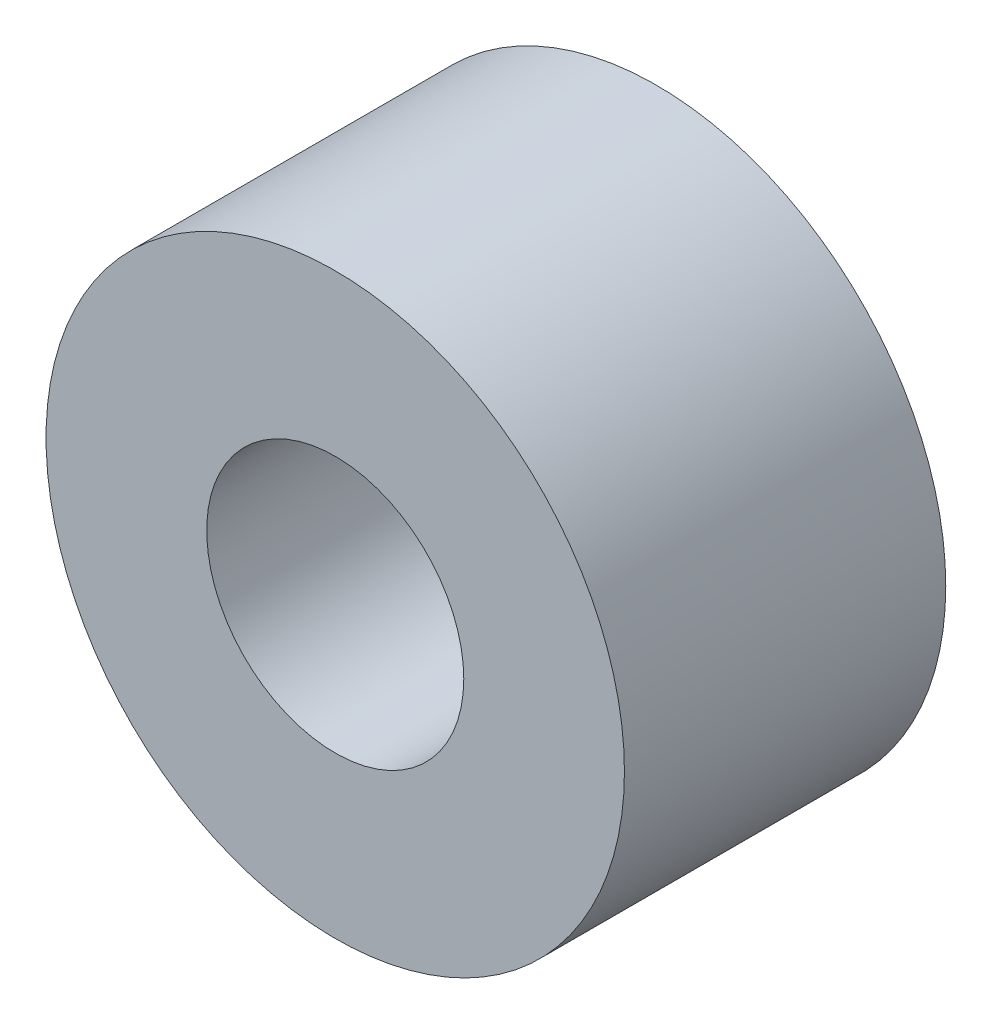
ISO-10303-21;
HEADER;
FILE_DESCRIPTION(('STEP AP214'),'2;1');
FILE_NAME('part.step','',(''),(''),'','','');
FILE_SCHEMA(('AUTOMOTIVE_DESIGN { 1 0 10303 214 1 1 1 1 }'));
ENDSEC;
DATA;
#1=APPLICATION_CONTEXT('core data for automotive mechanical design processes');
#2=APPLICATION_PROTOCOL_DEFINITION('international standard','automotive_design',2000,#1);
#3=PRODUCT_CONTEXT('',#1,'mechanical');
#4=PRODUCT('Part','Part','',(#3));
#5=PRODUCT_RELATED_PRODUCT_CATEGORY('part','',(#4));
#6=PRODUCT_DEFINITION_FORMATION('','',#4);
#7=PRODUCT_DEFINITION_CONTEXT('part definition',#1,'design');
#8=PRODUCT_DEFINITION('design','',#6,#7);
#9=PRODUCT_DEFINITION_SHAPE('','',#8);
#10=(LENGTH_UNIT() NAMED_UNIT(*) SI_UNIT(.MILLI.,.METRE.));
#11=(NAMED_UNIT(*) PLANE_ANGLE_UNIT() SI_UNIT($,.RADIAN.));
#12=(NAMED_UNIT(*) SI_UNIT($,.STERADIAN.) SOLID_ANGLE_UNIT());
#13=UNCERTAINTY_MEASURE_WITH_UNIT(LENGTH_MEASURE(1.E-05),#10,'distance_accuracy_value','');
#14=(GEOMETRIC_REPRESENTATION_CONTEXT(3) GLOBAL_UNCERTAINTY_ASSIGNED_CONTEXT((#13)) GLOBAL_UNIT_ASSIGNED_CONTEXT((#10,
#11,#12)) REPRESENTATION_CONTEXT('',''));
#15=CARTESIAN_POINT('',(0.,0.,0.));
#16=DIRECTION('',(0.,0.,1.));
#17=DIRECTION('',(1.,0.,0.));
#18=AXIS2_PLACEMENT_3D('',#15,#16,#17);
#19=CARTESIAN_POINT('',(0.,0.,10.));
#20=DIRECTION('',(0.,0.,1.));
#21=DIRECTION('',(1.,0.,0.));
#22=AXIS2_PLACEMENT_3D('',#19,#20,#21);
#23=PLANE('',#22);
#24=CARTESIAN_POINT('',(0.,0.,10.));
#25=DIRECTION('',(0.,0.,1.));
#26=DIRECTION('',(1.,0.,0.));
#27=AXIS2_PLACEMENT_3D('',#24,#25,#26);
#28=CIRCLE('',#27,9.);
#29=CARTESIAN_POINT('',(9.,0.,10.));
#30=VERTEX_POINT('',#29);
#31=EDGE_CURVE('E10',#30,#30,#28,.T.);
#32=ORIENTED_EDGE('',*,*,#31,.T.);
#33=EDGE_LOOP('',(#32));
#34=FACE_BOUND('',#33,.T.);
#35=CARTESIAN_POINT('',(0.,0.,10.));
#36=DIRECTION('',(0.,0.,1.));
#37=DIRECTION('',(1.,0.,0.));
#38=AXIS2_PLACEMENT_3D('',#35,#36,#37);
#39=CIRCLE('',#38,4.);
#40=CARTESIAN_POINT('',(4.,0.,10.));
#41=VERTEX_POINT('',#40);
#42=EDGE_CURVE('E44',#41,#41,#39,.T.);
#43=ORIENTED_EDGE('',*,*,#42,.F.);
#44=EDGE_LOOP('',(#43));
#45=FACE_BOUND('',#44,.T.);
#46=ADVANCED_FACE('F33',(#34,#45),#23,.T.);
#47=CARTESIAN_POINT('',(0.,0.,0.));
#48=DIRECTION('',(0.,0.,1.));
#49=DIRECTION('',(1.,0.,0.));
#50=AXIS2_PLACEMENT_3D('',#47,#48,#49);
#51=PLANE('',#50);
#52=CARTESIAN_POINT('',(0.,0.,0.));
#53=DIRECTION('',(0.,0.,1.));
#54=DIRECTION('',(1.,0.,0.));
#55=AXIS2_PLACEMENT_3D('',#52,#53,#54);
#56=CIRCLE('',#55,9.);
#57=CARTESIAN_POINT('',(9.,0.,0.));
#58=VERTEX_POINT('',#57);
#59=EDGE_CURVE('E37',#58,#58,#56,.T.);
#60=ORIENTED_EDGE('',*,*,#59,.F.);
#61=EDGE_LOOP('',(#60));
#62=FACE_BOUND('',#61,.T.);
#63=CARTESIAN_POINT('',(0.,0.,0.));
#64=DIRECTION('',(0.,0.,1.));
#65=DIRECTION('',(1.,0.,0.));
#66=AXIS2_PLACEMENT_3D('',#63,#64,#65);
#67=CIRCLE('',#66,4.);
#68=CARTESIAN_POINT('',(4.,0.,0.));
#69=VERTEX_POINT('',#68);
#70=EDGE_CURVE('E46',#69,#69,#67,.T.);
#71=ORIENTED_EDGE('',*,*,#70,.T.);
#72=EDGE_LOOP('',(#71));
#73=FACE_BOUND('',#72,.T.);
#74=ADVANCED_FACE('F56',(#62,#73),#51,.F.);
#75=CARTESIAN_POINT('',(0.,0.,10.));
#76=DIRECTION('',(0.,0.,-1.));
#77=DIRECTION('',(-1.,0.,0.));
#78=AXIS2_PLACEMENT_3D('',#75,#76,#77);
#79=CYLINDRICAL_SURFACE('',#78,9.);
#80=ORIENTED_EDGE('',*,*,#31,.F.);
#81=EDGE_LOOP('',(#80));
#82=FACE_BOUND('',#81,.T.);
#83=ORIENTED_EDGE('',*,*,#59,.T.);
#84=EDGE_LOOP('',(#83));
#85=FACE_BOUND('',#84,.T.);
#86=ADVANCED_FACE('F35',(#82,#85),#79,.T.);
#87=CARTESIAN_POINT('',(0.,0.,10.));
#88=DIRECTION('',(0.,0.,-1.));
#89=DIRECTION('',(-1.,0.,0.));
#90=AXIS2_PLACEMENT_3D('',#87,#88,#89);
#91=CYLINDRICAL_SURFACE('',#90,4.);
#92=ORIENTED_EDGE('',*,*,#42,.T.);
#93=EDGE_LOOP('',(#92));
#94=FACE_BOUND('',#93,.T.);
#95=ORIENTED_EDGE('',*,*,#70,.F.);
#96=EDGE_LOOP('',(#95));
#97=FACE_BOUND('',#96,.T.);
#98=ADVANCED_FACE('F52',(#94,#97),#91,.F.);
#99=CLOSED_SHELL('',(#46,#74,#86,#98));
#100=MANIFOLD_SOLID_BREP('B2',#99);
#101=ADVANCED_BREP_SHAPE_REPRESENTATION('',(#18,#100),#14);
#102=SHAPE_DEFINITION_REPRESENTATION(#9,#101);
ENDSEC;
END-ISO-10303-21;
